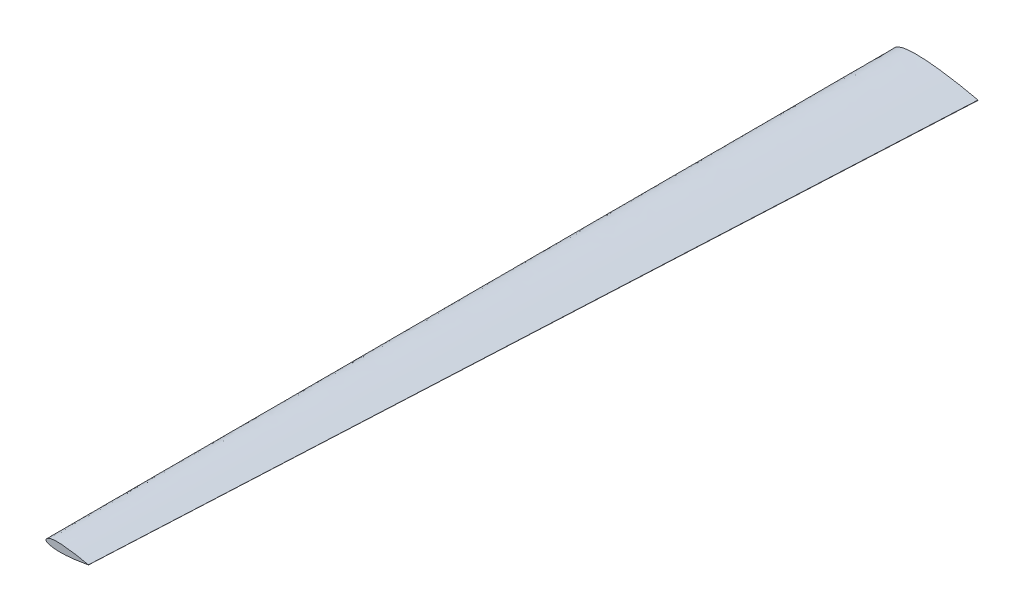
ISO-10303-21;
HEADER;
FILE_DESCRIPTION(('STEP AP214'),'2;1');
FILE_NAME('part.step','',(''),(''),'','','');
FILE_SCHEMA(('AUTOMOTIVE_DESIGN { 1 0 10303 214 1 1 1 1 }'));
ENDSEC;
DATA;
#1=APPLICATION_CONTEXT('core data for automotive mechanical design processes');
#2=APPLICATION_PROTOCOL_DEFINITION('international standard','automotive_design',2000,#1);
#3=PRODUCT_CONTEXT('',#1,'mechanical');
#4=PRODUCT('Part','Part','',(#3));
#5=PRODUCT_RELATED_PRODUCT_CATEGORY('part','',(#4));
#6=PRODUCT_DEFINITION_FORMATION('','',#4);
#7=PRODUCT_DEFINITION_CONTEXT('part definition',#1,'design');
#8=PRODUCT_DEFINITION('design','',#6,#7);
#9=PRODUCT_DEFINITION_SHAPE('','',#8);
#10=(LENGTH_UNIT() NAMED_UNIT(*) SI_UNIT(.MILLI.,.METRE.));
#11=(NAMED_UNIT(*) PLANE_ANGLE_UNIT() SI_UNIT($,.RADIAN.));
#12=(NAMED_UNIT(*) SI_UNIT($,.STERADIAN.) SOLID_ANGLE_UNIT());
#13=UNCERTAINTY_MEASURE_WITH_UNIT(LENGTH_MEASURE(1.E-05),#10,'distance_accuracy_value','');
#14=(GEOMETRIC_REPRESENTATION_CONTEXT(3) GLOBAL_UNCERTAINTY_ASSIGNED_CONTEXT((#13)) GLOBAL_UNIT_ASSIGNED_CONTEXT((#10,
#11,#12)) REPRESENTATION_CONTEXT('',''));
#15=CARTESIAN_POINT('',(0.,0.,0.));
#16=DIRECTION('',(0.,0.,1.));
#17=DIRECTION('',(1.,0.,0.));
#18=AXIS2_PLACEMENT_3D('',#15,#16,#17);
#19=CARTESIAN_POINT('',(-0.192501345121776,7.52816951627577,10000.));
#20=DIRECTION('',(0.,0.,-1.));
#21=DIRECTION('',(-1.,0.,0.));
#22=AXIS2_PLACEMENT_3D('',#19,#20,#21);
#23=PLANE('',#22);
#24=CARTESIAN_POINT('',(500.,0.95,10000.));
#25=CARTESIAN_POINT('',(491.671517999467,2.85534470563026,10000.));
#26=CARTESIAN_POINT('',(475.035499082105,6.66124241483217,10000.));
#27=CARTESIAN_POINT('',(441.71140179049,13.7324950796743,10000.));
#28=CARTESIAN_POINT('',(400.111932775252,22.2064214123205,10000.));
#29=CARTESIAN_POINT('',(350.080595829334,31.0308917232508,10000.));
#30=CARTESIAN_POINT('',(300.098259063372,38.9806362483823,10000.));
#31=CARTESIAN_POINT('',(250.084574606085,45.4660160131807,10000.));
#32=CARTESIAN_POINT('',(200.094999655235,50.593534549724,10000.));
#33=CARTESIAN_POINT('',(158.359488063428,52.8664588396826,10000.));
#34=CARTESIAN_POINT('',(124.991126468129,52.9700621885772,10000.));
#35=CARTESIAN_POINT('',(99.9512426235117,52.0252247565962,10000.));
#36=CARTESIAN_POINT('',(74.8205257490471,49.7006336339109,10000.));
#37=CARTESIAN_POINT('',(53.8685257903785,45.6265340646465,10000.));
#38=CARTESIAN_POINT('',(37.2896715352329,40.1531215628574,10000.));
#39=CARTESIAN_POINT('',(24.4442475905609,34.7979220099527,10000.));
#40=CARTESIAN_POINT('',(13.8954739361213,27.9442410225147,10000.));
#41=CARTESIAN_POINT('',(2.95227969460832,18.0354510437069,10000.));
#42=CARTESIAN_POINT('',(-3.72395155860115,2.58198831078951,10000.));
#43=CARTESIAN_POINT('',(5.13201498916292,-8.81701057550311,10000.));
#44=CARTESIAN_POINT('',(14.048997488678,-14.8363930021038,10000.));
#45=CARTESIAN_POINT('',(24.8118580487578,-19.0849159274474,10000.));
#46=CARTESIAN_POINT('',(37.3719699761508,-23.1348076448292,10000.));
#47=CARTESIAN_POINT('',(54.0671124250217,-27.1500628156084,10000.));
#48=CARTESIAN_POINT('',(74.8891712473024,-31.1014468743309,10000.));
#49=CARTESIAN_POINT('',(99.926421302996,-34.534236853697,10000.));
#50=CARTESIAN_POINT('',(124.969792967423,-36.5130464864079,10000.));
#51=CARTESIAN_POINT('',(158.319682029866,-37.8294377253852,10000.));
#52=CARTESIAN_POINT('',(200.04281964114,-37.2118225995674,10000.));
#53=CARTESIAN_POINT('',(250.054761000451,-34.2913186668339,10000.));
#54=CARTESIAN_POINT('',(300.06169813208,-29.899017988362,10000.));
#55=CARTESIAN_POINT('',(350.06696882488,-24.2756142043169,10000.));
#56=CARTESIAN_POINT('',(400.069473879809,-17.5491866451113,10000.));
#57=CARTESIAN_POINT('',(441.715379574296,-11.1513741168022,10000.));
#58=CARTESIAN_POINT('',(475.022957901083,-5.49719905230475,10000.));
#59=CARTESIAN_POINT('',(491.669608412508,-2.46659065881192,10000.));
#60=CARTESIAN_POINT('',(500.,-0.95,10000.));
#61=B_SPLINE_CURVE_WITH_KNOTS('',3,(#24,#25,#26,#27,#28,#29,#30,#31,#32,#33,#34,#35,#36,#37,#38,
#39,#40,#41,#42,#43,#44,#45,#46,#47,#48,#49,#50,#51,#52,#53,#54,#55,#56,#57,#58,#59,#60),
.UNSPECIFIED.,.F.,.F.,(4,1,1,1,1,1,1,1,1,1,1,1,1,1,1,1,1,1,1,1,1,1,1,1,1,1,1,1,1,1,1,1,1,1,4),
(0.,0.0246853026107639,0.0493085247932527,0.0984277798669679,0.147340829264032,0.19608682561154,
0.244648149159686,0.293039672039672,0.34125836767159,0.365336470468722,0.389433779854687,
0.413631925288818,0.438215560120242,0.450885651195498,0.464019209238406,0.478391125547502,
0.486735482988752,0.507330652339293,0.518002854522379,0.5253644416349,0.538497999677808,
0.551138405064355,0.563542132591797,0.588059977509228,0.612359685769216,0.636518555207915,
0.660615864593879,0.708774381621293,0.757005940576549,0.805343953096738,0.853801156208726,
0.902387687472207,0.951111485792716,0.975534990225343,1.),.UNSPECIFIED.);
#62=CARTESIAN_POINT('',(500.,0.95,10000.));
#63=VERTEX_POINT('',#62);
#64=CARTESIAN_POINT('',(500.,-0.95,10000.));
#65=VERTEX_POINT('',#64);
#66=EDGE_CURVE('E42',#63,#65,#61,.T.);
#67=ORIENTED_EDGE('',*,*,#66,.T.);
#68=DIRECTION('',(0.,1.,0.));
#69=VECTOR('',#68,1.);
#70=CARTESIAN_POINT('',(500.,0.95,10000.));
#71=LINE('',#70,#69);
#72=EDGE_CURVE('E11',#65,#63,#71,.T.);
#73=ORIENTED_EDGE('',*,*,#72,.T.);
#74=EDGE_LOOP('',(#67,#73));
#75=FACE_BOUND('',#74,.T.);
#76=ADVANCED_FACE('F35',(#75),#23,.F.);
#77=CARTESIAN_POINT('',(-0.385002690243552,15.0563390325515,0.));
#78=DIRECTION('',(0.,0.,-1.));
#79=DIRECTION('',(-1.,0.,0.));
#80=AXIS2_PLACEMENT_3D('',#77,#78,#79);
#81=PLANE('',#80);
#82=CARTESIAN_POINT('',(1000.,1.9,0.));
#83=CARTESIAN_POINT('',(983.343035998933,5.71068941126051,0.));
#84=CARTESIAN_POINT('',(950.07099816421,13.3224848296643,0.));
#85=CARTESIAN_POINT('',(883.42280358098,27.4649901593486,0.));
#86=CARTESIAN_POINT('',(800.223865550504,44.412842824641,0.));
#87=CARTESIAN_POINT('',(700.161191658669,62.0617834465015,0.));
#88=CARTESIAN_POINT('',(600.196518126745,77.9612724967645,0.));
#89=CARTESIAN_POINT('',(500.16914921217,90.9320320263615,0.));
#90=CARTESIAN_POINT('',(400.189999310469,101.187069099448,0.));
#91=CARTESIAN_POINT('',(316.718976126857,105.732917679365,0.));
#92=CARTESIAN_POINT('',(249.982252936258,105.940124377154,0.));
#93=CARTESIAN_POINT('',(199.902485247023,104.050449513192,0.));
#94=CARTESIAN_POINT('',(149.641051498094,99.4012672678218,0.));
#95=CARTESIAN_POINT('',(107.737051580757,91.253068129293,0.));
#96=CARTESIAN_POINT('',(74.5793430704657,80.3062431257147,0.));
#97=CARTESIAN_POINT('',(48.8884951811217,69.5958440199055,0.));
#98=CARTESIAN_POINT('',(27.7909478722426,55.8884820450294,0.));
#99=CARTESIAN_POINT('',(5.90455938921664,36.0709020874139,0.));
#100=CARTESIAN_POINT('',(-7.4479031172023,5.16397662157903,0.));
#101=CARTESIAN_POINT('',(10.2640299783258,-17.6340211510062,0.));
#102=CARTESIAN_POINT('',(28.0979949773559,-29.6727860042076,0.));
#103=CARTESIAN_POINT('',(49.6237160975156,-38.1698318548947,0.));
#104=CARTESIAN_POINT('',(74.7439399523016,-46.2696152896583,0.));
#105=CARTESIAN_POINT('',(108.134224850043,-54.3001256312167,0.));
#106=CARTESIAN_POINT('',(149.778342494605,-62.2028937486618,0.));
#107=CARTESIAN_POINT('',(199.852842605992,-69.0684737073941,0.));
#108=CARTESIAN_POINT('',(249.939585934847,-73.0260929728157,0.));
#109=CARTESIAN_POINT('',(316.639364059732,-75.6588754507703,0.));
#110=CARTESIAN_POINT('',(400.085639282281,-74.4236451991348,0.));
#111=CARTESIAN_POINT('',(500.109522000903,-68.5826373336678,0.));
#112=CARTESIAN_POINT('',(600.12339626416,-59.798035976724,0.));
#113=CARTESIAN_POINT('',(700.133937649759,-48.5512284086338,0.));
#114=CARTESIAN_POINT('',(800.138947759619,-35.0983732902226,0.));
#115=CARTESIAN_POINT('',(883.430759148592,-22.3027482336043,0.));
#116=CARTESIAN_POINT('',(950.045915802167,-10.9943981046095,0.));
#117=CARTESIAN_POINT('',(983.339216825017,-4.93318131762384,0.));
#118=CARTESIAN_POINT('',(1000.,-1.9,0.));
#119=B_SPLINE_CURVE_WITH_KNOTS('',3,(#82,#83,#84,#85,#86,#87,#88,#89,#90,#91,#92,#93,#94,#95,
#96,#97,#98,#99,#100,#101,#102,#103,#104,#105,#106,#107,#108,#109,#110,#111,#112,#113,#114,#115,
#116,#117,#118),.UNSPECIFIED.,.F.,.F.,(4,1,1,1,1,1,1,1,1,1,1,1,1,1,1,1,1,1,1,1,1,1,1,1,1,1,1,1,
1,1,1,1,1,1,4),(0.,0.0246853026107639,0.0493085247932527,0.0984277798669679,0.147340829264032,
0.19608682561154,0.244648149159686,0.293039672039672,0.34125836767159,0.365336470468722,
0.389433779854687,0.413631925288818,0.438215560120242,0.450885651195498,0.464019209238406,
0.478391125547502,0.486735482988752,0.507330652339293,0.518002854522379,0.5253644416349,
0.538497999677808,0.551138405064355,0.563542132591797,0.588059977509228,0.612359685769216,
0.636518555207915,0.660615864593879,0.708774381621293,0.757005940576549,0.805343953096738,
0.853801156208726,0.902387687472207,0.951111485792716,0.975534990225343,1.),.UNSPECIFIED.);
#120=CARTESIAN_POINT('',(1000.,1.9,0.));
#121=VERTEX_POINT('',#120);
#122=CARTESIAN_POINT('',(1000.,-1.9,0.));
#123=VERTEX_POINT('',#122);
#124=EDGE_CURVE('E63',#121,#123,#119,.T.);
#125=ORIENTED_EDGE('',*,*,#124,.F.);
#126=DIRECTION('',(0.,1.,0.));
#127=VECTOR('',#126,1.);
#128=CARTESIAN_POINT('',(1000.,1.9,0.));
#129=LINE('',#128,#127);
#130=EDGE_CURVE('E66',#123,#121,#129,.T.);
#131=ORIENTED_EDGE('',*,*,#130,.F.);
#132=EDGE_LOOP('',(#125,#131));
#133=FACE_BOUND('',#132,.T.);
#134=ADVANCED_FACE('F71',(#133),#81,.T.);
#135=CARTESIAN_POINT('',(997.506234413965,0.,49.8753117206983));
#136=DIRECTION('',(-0.998752338877845,0.,-0.0499376169438922));
#137=DIRECTION('',(-0.0499376169438922,0.,0.998752338877845));
#138=AXIS2_PLACEMENT_3D('',#135,#136,#137);
#139=PLANE('',#138);
#140=DIRECTION('',(-0.0499376167191107,-9.48814717663103E-05,0.998752334382214));
#141=VECTOR('',#140,1.);
#142=CARTESIAN_POINT('',(1000.,1.9,0.));
#143=LINE('',#142,#141);
#144=EDGE_CURVE('E59',#121,#63,#143,.T.);
#145=ORIENTED_EDGE('',*,*,#144,.T.);
#146=ORIENTED_EDGE('',*,*,#72,.F.);
#147=DIRECTION('',(-0.0499376167191107,9.48814717663103E-05,0.998752334382214));
#148=VECTOR('',#147,1.);
#149=CARTESIAN_POINT('',(1000.,-1.9,0.));
#150=LINE('',#149,#148);
#151=EDGE_CURVE('E49',#123,#65,#150,.T.);
#152=ORIENTED_EDGE('',*,*,#151,.F.);
#153=ORIENTED_EDGE('',*,*,#130,.T.);
#154=EDGE_LOOP('',(#145,#146,#152,#153));
#155=FACE_BOUND('',#154,.T.);
#156=ADVANCED_FACE('F68',(#155),#139,.F.);
#157=CARTESIAN_POINT('',(1000.,1.9,0.));
#158=CARTESIAN_POINT('',(500.,0.95,10000.));
#159=CARTESIAN_POINT('',(983.343035998933,5.71068941126051,0.));
#160=CARTESIAN_POINT('',(491.671517999467,2.85534470563026,10000.));
#161=CARTESIAN_POINT('',(950.07099816421,13.3224848296643,0.));
#162=CARTESIAN_POINT('',(475.035499082105,6.66124241483217,10000.));
#163=CARTESIAN_POINT('',(883.42280358098,27.4649901593486,0.));
#164=CARTESIAN_POINT('',(441.71140179049,13.7324950796743,10000.));
#165=CARTESIAN_POINT('',(800.223865550504,44.412842824641,0.));
#166=CARTESIAN_POINT('',(400.111932775252,22.2064214123205,10000.));
#167=CARTESIAN_POINT('',(700.161191658669,62.0617834465015,0.));
#168=CARTESIAN_POINT('',(350.080595829334,31.0308917232508,10000.));
#169=CARTESIAN_POINT('',(600.196518126745,77.9612724967645,0.));
#170=CARTESIAN_POINT('',(300.098259063372,38.9806362483823,10000.));
#171=CARTESIAN_POINT('',(500.16914921217,90.9320320263615,0.));
#172=CARTESIAN_POINT('',(250.084574606085,45.4660160131807,10000.));
#173=CARTESIAN_POINT('',(400.189999310469,101.187069099448,0.));
#174=CARTESIAN_POINT('',(200.094999655235,50.593534549724,10000.));
#175=CARTESIAN_POINT('',(316.718976126857,105.732917679365,0.));
#176=CARTESIAN_POINT('',(158.359488063428,52.8664588396826,10000.));
#177=CARTESIAN_POINT('',(249.982252936258,105.940124377154,0.));
#178=CARTESIAN_POINT('',(124.991126468129,52.9700621885772,10000.));
#179=CARTESIAN_POINT('',(199.902485247023,104.050449513192,0.));
#180=CARTESIAN_POINT('',(99.9512426235117,52.0252247565962,10000.));
#181=CARTESIAN_POINT('',(149.641051498094,99.4012672678218,0.));
#182=CARTESIAN_POINT('',(74.8205257490471,49.7006336339109,10000.));
#183=CARTESIAN_POINT('',(107.737051580757,91.253068129293,0.));
#184=CARTESIAN_POINT('',(53.8685257903785,45.6265340646465,10000.));
#185=CARTESIAN_POINT('',(74.5793430704657,80.3062431257147,0.));
#186=CARTESIAN_POINT('',(37.2896715352329,40.1531215628574,10000.));
#187=CARTESIAN_POINT('',(48.8884951811217,69.5958440199055,0.));
#188=CARTESIAN_POINT('',(24.4442475905609,34.7979220099527,10000.));
#189=CARTESIAN_POINT('',(27.7909478722426,55.8884820450294,0.));
#190=CARTESIAN_POINT('',(13.8954739361213,27.9442410225147,10000.));
#191=CARTESIAN_POINT('',(5.90455938921664,36.0709020874139,0.));
#192=CARTESIAN_POINT('',(2.95227969460832,18.0354510437069,10000.));
#193=CARTESIAN_POINT('',(-7.4479031172023,5.16397662157903,0.));
#194=CARTESIAN_POINT('',(-3.72395155860115,2.58198831078951,10000.));
#195=CARTESIAN_POINT('',(10.2640299783258,-17.6340211510062,0.));
#196=CARTESIAN_POINT('',(5.13201498916292,-8.81701057550311,10000.));
#197=CARTESIAN_POINT('',(28.0979949773559,-29.6727860042076,0.));
#198=CARTESIAN_POINT('',(14.048997488678,-14.8363930021038,10000.));
#199=CARTESIAN_POINT('',(49.6237160975156,-38.1698318548947,0.));
#200=CARTESIAN_POINT('',(24.8118580487578,-19.0849159274474,10000.));
#201=CARTESIAN_POINT('',(74.7439399523016,-46.2696152896583,0.));
#202=CARTESIAN_POINT('',(37.3719699761508,-23.1348076448292,10000.));
#203=CARTESIAN_POINT('',(108.134224850043,-54.3001256312167,0.));
#204=CARTESIAN_POINT('',(54.0671124250217,-27.1500628156084,10000.));
#205=CARTESIAN_POINT('',(149.778342494605,-62.2028937486618,0.));
#206=CARTESIAN_POINT('',(74.8891712473024,-31.1014468743309,10000.));
#207=CARTESIAN_POINT('',(199.852842605992,-69.0684737073941,0.));
#208=CARTESIAN_POINT('',(99.926421302996,-34.534236853697,10000.));
#209=CARTESIAN_POINT('',(249.939585934847,-73.0260929728157,0.));
#210=CARTESIAN_POINT('',(124.969792967423,-36.5130464864079,10000.));
#211=CARTESIAN_POINT('',(316.639364059732,-75.6588754507703,0.));
#212=CARTESIAN_POINT('',(158.319682029866,-37.8294377253852,10000.));
#213=CARTESIAN_POINT('',(400.085639282281,-74.4236451991348,0.));
#214=CARTESIAN_POINT('',(200.04281964114,-37.2118225995674,10000.));
#215=CARTESIAN_POINT('',(500.109522000903,-68.5826373336678,0.));
#216=CARTESIAN_POINT('',(250.054761000451,-34.2913186668339,10000.));
#217=CARTESIAN_POINT('',(600.12339626416,-59.798035976724,0.));
#218=CARTESIAN_POINT('',(300.06169813208,-29.899017988362,10000.));
#219=CARTESIAN_POINT('',(700.133937649759,-48.5512284086338,0.));
#220=CARTESIAN_POINT('',(350.06696882488,-24.2756142043169,10000.));
#221=CARTESIAN_POINT('',(800.138947759619,-35.0983732902226,0.));
#222=CARTESIAN_POINT('',(400.069473879809,-17.5491866451113,10000.));
#223=CARTESIAN_POINT('',(883.430759148592,-22.3027482336043,0.));
#224=CARTESIAN_POINT('',(441.715379574296,-11.1513741168022,10000.));
#225=CARTESIAN_POINT('',(950.045915802167,-10.9943981046095,0.));
#226=CARTESIAN_POINT('',(475.022957901083,-5.49719905230475,10000.));
#227=CARTESIAN_POINT('',(983.339216825017,-4.93318131762384,0.));
#228=CARTESIAN_POINT('',(491.669608412508,-2.46659065881192,10000.));
#229=CARTESIAN_POINT('',(1000.,-1.9,0.));
#230=CARTESIAN_POINT('',(500.,-0.95,10000.));
#231=B_SPLINE_SURFACE_WITH_KNOTS('',3,1,((#157,#158),(#159,#160),(#161,#162),(#163,#164),(#165,
#166),(#167,#168),(#169,#170),(#171,#172),(#173,#174),(#175,#176),(#177,#178),(#179,#180),(#181,
#182),(#183,#184),(#185,#186),(#187,#188),(#189,#190),(#191,#192),(#193,#194),(#195,#196),(#197,
#198),(#199,#200),(#201,#202),(#203,#204),(#205,#206),(#207,#208),(#209,#210),(#211,#212),(#213,
#214),(#215,#216),(#217,#218),(#219,#220),(#221,#222),(#223,#224),(#225,#226),(#227,#228),(#229,
#230)),.UNSPECIFIED.,.F.,.F.,.F.,(4,1,1,1,1,1,1,1,1,1,1,1,1,1,1,1,1,1,1,1,1,1,1,1,1,1,1,1,1,1,1,
1,1,1,4),(2,2),(0.,0.0246853026107639,0.0493085247932527,0.0984277798669679,0.147340829264032,
0.19608682561154,0.244648149159686,0.293039672039672,0.34125836767159,0.365336470468722,
0.389433779854687,0.413631925288818,0.438215560120242,0.450885651195498,0.464019209238406,
0.478391125547502,0.486735482988752,0.507330652339293,0.518002854522379,0.5253644416349,
0.538497999677808,0.551138405064355,0.563542132591797,0.588059977509228,0.612359685769216,
0.636518555207915,0.660615864593879,0.708774381621293,0.757005940576549,0.805343953096738,
0.853801156208726,0.902387687472207,0.951111485792716,0.975534990225343,1.),(0.,1.),.UNSPECIFIED.);
#232=ORIENTED_EDGE('',*,*,#124,.T.);
#233=ORIENTED_EDGE('',*,*,#151,.T.);
#234=ORIENTED_EDGE('',*,*,#66,.F.);
#235=ORIENTED_EDGE('',*,*,#144,.F.);
#236=EDGE_LOOP('',(#232,#233,#234,#235));
#237=FACE_BOUND('',#236,.T.);
#238=ADVANCED_FACE('F61',(#237),#231,.T.);
#239=CLOSED_SHELL('',(#76,#134,#156,#238));
#240=MANIFOLD_SOLID_BREP('B2',#239);
#241=ADVANCED_BREP_SHAPE_REPRESENTATION('',(#18,#240),#14);
#242=SHAPE_DEFINITION_REPRESENTATION(#9,#241);
ENDSEC;
END-ISO-10303-21;
